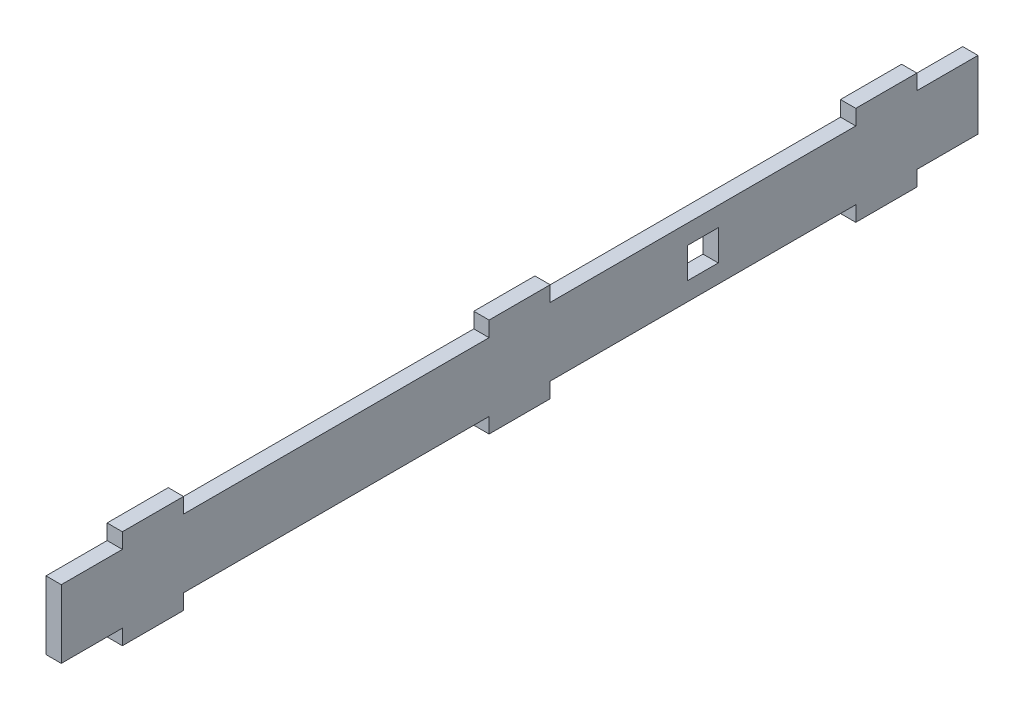
ISO-10303-21;
HEADER;
FILE_DESCRIPTION(('STEP AP214'),'2;1');
FILE_NAME('part.step','',(''),(''),'','','');
FILE_SCHEMA(('AUTOMOTIVE_DESIGN { 1 0 10303 214 1 1 1 1 }'));
ENDSEC;
DATA;
#1=APPLICATION_CONTEXT('core data for automotive mechanical design processes');
#2=APPLICATION_PROTOCOL_DEFINITION('international standard','automotive_design',2000,#1);
#3=PRODUCT_CONTEXT('',#1,'mechanical');
#4=PRODUCT('Part','Part','',(#3));
#5=PRODUCT_RELATED_PRODUCT_CATEGORY('part','',(#4));
#6=PRODUCT_DEFINITION_FORMATION('','',#4);
#7=PRODUCT_DEFINITION_CONTEXT('part definition',#1,'design');
#8=PRODUCT_DEFINITION('design','',#6,#7);
#9=PRODUCT_DEFINITION_SHAPE('','',#8);
#10=(LENGTH_UNIT() NAMED_UNIT(*) SI_UNIT(.MILLI.,.METRE.));
#11=(NAMED_UNIT(*) PLANE_ANGLE_UNIT() SI_UNIT($,.RADIAN.));
#12=(NAMED_UNIT(*) SI_UNIT($,.STERADIAN.) SOLID_ANGLE_UNIT());
#13=UNCERTAINTY_MEASURE_WITH_UNIT(LENGTH_MEASURE(1.E-05),#10,'distance_accuracy_value','');
#14=(GEOMETRIC_REPRESENTATION_CONTEXT(3) GLOBAL_UNCERTAINTY_ASSIGNED_CONTEXT((#13)) GLOBAL_UNIT_ASSIGNED_CONTEXT((#10,
#11,#12)) REPRESENTATION_CONTEXT('',''));
#15=CARTESIAN_POINT('',(0.,0.,0.));
#16=DIRECTION('',(0.,0.,1.));
#17=DIRECTION('',(1.,0.,0.));
#18=AXIS2_PLACEMENT_3D('',#15,#16,#17);
#19=CARTESIAN_POINT('',(5.,0.,0.));
#20=DIRECTION('',(0.,1.,0.));
#21=DIRECTION('',(0.,0.,1.));
#22=AXIS2_PLACEMENT_3D('',#19,#20,#21);
#23=PLANE('',#22);
#24=DIRECTION('',(-1.,0.,0.));
#25=VECTOR('',#24,1.);
#26=CARTESIAN_POINT('',(5.,0.,-260.));
#27=LINE('',#26,#25);
#28=CARTESIAN_POINT('',(5.,0.,-260.));
#29=VERTEX_POINT('',#28);
#30=CARTESIAN_POINT('',(0.,0.,-260.));
#31=VERTEX_POINT('',#30);
#32=EDGE_CURVE('E292',#29,#31,#27,.T.);
#33=ORIENTED_EDGE('',*,*,#32,.F.);
#34=DIRECTION('',(0.,0.,-1.));
#35=VECTOR('',#34,1.);
#36=CARTESIAN_POINT('',(5.,0.,0.));
#37=LINE('',#36,#35);
#38=CARTESIAN_POINT('',(5.,0.,-160.));
#39=VERTEX_POINT('',#38);
#40=EDGE_CURVE('E592',#39,#29,#37,.T.);
#41=ORIENTED_EDGE('',*,*,#40,.F.);
#42=DIRECTION('',(1.,0.,0.));
#43=VECTOR('',#42,1.);
#44=CARTESIAN_POINT('',(5.,0.,-160.));
#45=LINE('',#44,#43);
#46=CARTESIAN_POINT('',(0.,0.,-160.));
#47=VERTEX_POINT('',#46);
#48=EDGE_CURVE('E340',#47,#39,#45,.T.);
#49=ORIENTED_EDGE('',*,*,#48,.F.);
#50=DIRECTION('',(0.,0.,-1.));
#51=VECTOR('',#50,1.);
#52=CARTESIAN_POINT('',(0.,0.,0.));
#53=LINE('',#52,#51);
#54=EDGE_CURVE('E616',#47,#31,#53,.T.);
#55=ORIENTED_EDGE('',*,*,#54,.T.);
#56=EDGE_LOOP('',(#33,#41,#49,#55));
#57=FACE_BOUND('',#56,.T.);
#58=ADVANCED_FACE('F39',(#57),#23,.F.);
#59=DIRECTION('',(1.,0.,0.));
#60=VECTOR('',#59,1.);
#61=CARTESIAN_POINT('',(5.,0.,-280.));
#62=LINE('',#61,#60);
#63=CARTESIAN_POINT('',(0.,0.,-280.));
#64=VERTEX_POINT('',#63);
#65=CARTESIAN_POINT('',(5.,0.,-280.));
#66=VERTEX_POINT('',#65);
#67=EDGE_CURVE('E303',#64,#66,#62,.T.);
#68=ORIENTED_EDGE('',*,*,#67,.F.);
#69=CARTESIAN_POINT('',(0.,0.,-300.));
#70=VERTEX_POINT('',#69);
#71=EDGE_CURVE('E545',#64,#70,#53,.T.);
#72=ORIENTED_EDGE('',*,*,#71,.T.);
#73=DIRECTION('',(-1.,0.,0.));
#74=VECTOR('',#73,1.);
#75=CARTESIAN_POINT('',(5.,0.,-300.));
#76=LINE('',#75,#74);
#77=CARTESIAN_POINT('',(5.,0.,-300.));
#78=VERTEX_POINT('',#77);
#79=EDGE_CURVE('E48',#78,#70,#76,.T.);
#80=ORIENTED_EDGE('',*,*,#79,.F.);
#81=EDGE_CURVE('E524',#66,#78,#37,.T.);
#82=ORIENTED_EDGE('',*,*,#81,.F.);
#83=EDGE_LOOP('',(#68,#72,#80,#82));
#84=FACE_BOUND('',#83,.T.);
#85=ADVANCED_FACE('F626',(#84),#23,.F.);
#86=DIRECTION('',(-1.,0.,0.));
#87=VECTOR('',#86,1.);
#88=CARTESIAN_POINT('',(5.,0.,-140.));
#89=LINE('',#88,#87);
#90=CARTESIAN_POINT('',(5.,0.,-140.));
#91=VERTEX_POINT('',#90);
#92=CARTESIAN_POINT('',(0.,0.,-140.));
#93=VERTEX_POINT('',#92);
#94=EDGE_CURVE('E334',#91,#93,#89,.T.);
#95=ORIENTED_EDGE('',*,*,#94,.F.);
#96=CARTESIAN_POINT('',(5.,0.,-40.));
#97=VERTEX_POINT('',#96);
#98=EDGE_CURVE('E531',#97,#91,#37,.T.);
#99=ORIENTED_EDGE('',*,*,#98,.F.);
#100=DIRECTION('',(1.,0.,0.));
#101=VECTOR('',#100,1.);
#102=CARTESIAN_POINT('',(5.,0.,-40.));
#103=LINE('',#102,#101);
#104=CARTESIAN_POINT('',(0.,0.,-40.));
#105=VERTEX_POINT('',#104);
#106=EDGE_CURVE('E377',#105,#97,#103,.T.);
#107=ORIENTED_EDGE('',*,*,#106,.F.);
#108=EDGE_CURVE('E550',#105,#93,#53,.T.);
#109=ORIENTED_EDGE('',*,*,#108,.T.);
#110=EDGE_LOOP('',(#95,#99,#107,#109));
#111=FACE_BOUND('',#110,.T.);
#112=ADVANCED_FACE('F631',(#111),#23,.F.);
#113=DIRECTION('',(-1.,0.,0.));
#114=VECTOR('',#113,1.);
#115=CARTESIAN_POINT('',(5.,0.,-20.));
#116=LINE('',#115,#114);
#117=CARTESIAN_POINT('',(5.,0.,-20.));
#118=VERTEX_POINT('',#117);
#119=CARTESIAN_POINT('',(0.,0.,-20.));
#120=VERTEX_POINT('',#119);
#121=EDGE_CURVE('E371',#118,#120,#116,.T.);
#122=ORIENTED_EDGE('',*,*,#121,.F.);
#123=CARTESIAN_POINT('',(5.,0.,0.));
#124=VERTEX_POINT('',#123);
#125=EDGE_CURVE('E526',#124,#118,#37,.T.);
#126=ORIENTED_EDGE('',*,*,#125,.F.);
#127=DIRECTION('',(-1.,0.,0.));
#128=VECTOR('',#127,1.);
#129=CARTESIAN_POINT('',(5.,0.,0.));
#130=LINE('',#129,#128);
#131=CARTESIAN_POINT('',(0.,0.,0.));
#132=VERTEX_POINT('',#131);
#133=EDGE_CURVE('E11',#124,#132,#130,.T.);
#134=ORIENTED_EDGE('',*,*,#133,.T.);
#135=EDGE_CURVE('E546',#132,#120,#53,.T.);
#136=ORIENTED_EDGE('',*,*,#135,.T.);
#137=EDGE_LOOP('',(#122,#126,#134,#136));
#138=FACE_BOUND('',#137,.T.);
#139=ADVANCED_FACE('F644',(#138),#23,.F.);
#140=CARTESIAN_POINT('',(5.,22.32,0.));
#141=DIRECTION('',(0.,-1.,0.));
#142=DIRECTION('',(0.,0.,-1.));
#143=AXIS2_PLACEMENT_3D('',#140,#141,#142);
#144=PLANE('',#143);
#145=DIRECTION('',(1.,0.,0.));
#146=VECTOR('',#145,1.);
#147=CARTESIAN_POINT('',(0.,22.32,-140.));
#148=LINE('',#147,#146);
#149=CARTESIAN_POINT('',(0.,22.32,-140.));
#150=VERTEX_POINT('',#149);
#151=CARTESIAN_POINT('',(5.,22.32,-140.));
#152=VERTEX_POINT('',#151);
#153=EDGE_CURVE('E408',#150,#152,#148,.T.);
#154=ORIENTED_EDGE('',*,*,#153,.F.);
#155=DIRECTION('',(0.,0.,1.));
#156=VECTOR('',#155,1.);
#157=CARTESIAN_POINT('',(0.,22.32,0.));
#158=LINE('',#157,#156);
#159=CARTESIAN_POINT('',(0.,22.32,-40.));
#160=VERTEX_POINT('',#159);
#161=EDGE_CURVE('E557',#150,#160,#158,.T.);
#162=ORIENTED_EDGE('',*,*,#161,.T.);
#163=DIRECTION('',(-1.,0.,0.));
#164=VECTOR('',#163,1.);
#165=CARTESIAN_POINT('',(0.,22.32,-40.));
#166=LINE('',#165,#164);
#167=CARTESIAN_POINT('',(5.,22.32,-40.));
#168=VERTEX_POINT('',#167);
#169=EDGE_CURVE('E488',#168,#160,#166,.T.);
#170=ORIENTED_EDGE('',*,*,#169,.F.);
#171=DIRECTION('',(0.,0.,1.));
#172=VECTOR('',#171,1.);
#173=CARTESIAN_POINT('',(5.,22.32,0.));
#174=LINE('',#173,#172);
#175=EDGE_CURVE('E541',#152,#168,#174,.T.);
#176=ORIENTED_EDGE('',*,*,#175,.F.);
#177=EDGE_LOOP('',(#154,#162,#170,#176));
#178=FACE_BOUND('',#177,.T.);
#179=ADVANCED_FACE('F669',(#178),#144,.F.);
#180=DIRECTION('',(-1.,0.,0.));
#181=VECTOR('',#180,1.);
#182=CARTESIAN_POINT('',(0.,22.32,-160.));
#183=LINE('',#182,#181);
#184=CARTESIAN_POINT('',(5.,22.32,-160.));
#185=VERTEX_POINT('',#184);
#186=CARTESIAN_POINT('',(0.,22.32,-160.));
#187=VERTEX_POINT('',#186);
#188=EDGE_CURVE('E414',#185,#187,#183,.T.);
#189=ORIENTED_EDGE('',*,*,#188,.F.);
#190=CARTESIAN_POINT('',(5.,22.32,-260.));
#191=VERTEX_POINT('',#190);
#192=EDGE_CURVE('E540',#191,#185,#174,.T.);
#193=ORIENTED_EDGE('',*,*,#192,.F.);
#194=DIRECTION('',(1.,0.,0.));
#195=VECTOR('',#194,1.);
#196=CARTESIAN_POINT('',(0.,22.32,-260.));
#197=LINE('',#196,#195);
#198=CARTESIAN_POINT('',(0.,22.32,-260.));
#199=VERTEX_POINT('',#198);
#200=EDGE_CURVE('E445',#199,#191,#197,.T.);
#201=ORIENTED_EDGE('',*,*,#200,.F.);
#202=EDGE_CURVE('E556',#199,#187,#158,.T.);
#203=ORIENTED_EDGE('',*,*,#202,.T.);
#204=EDGE_LOOP('',(#189,#193,#201,#203));
#205=FACE_BOUND('',#204,.T.);
#206=ADVANCED_FACE('F674',(#205),#144,.F.);
#207=DIRECTION('',(-1.,0.,0.));
#208=VECTOR('',#207,1.);
#209=CARTESIAN_POINT('',(0.,22.32,-280.));
#210=LINE('',#209,#208);
#211=CARTESIAN_POINT('',(5.,22.32,-280.));
#212=VERTEX_POINT('',#211);
#213=CARTESIAN_POINT('',(0.,22.32,-280.));
#214=VERTEX_POINT('',#213);
#215=EDGE_CURVE('E451',#212,#214,#210,.T.);
#216=ORIENTED_EDGE('',*,*,#215,.F.);
#217=CARTESIAN_POINT('',(5.,22.32,-300.));
#218=VERTEX_POINT('',#217);
#219=EDGE_CURVE('E535',#218,#212,#174,.T.);
#220=ORIENTED_EDGE('',*,*,#219,.F.);
#221=DIRECTION('',(-1.,0.,0.));
#222=VECTOR('',#221,1.);
#223=CARTESIAN_POINT('',(5.,22.32,-300.));
#224=LINE('',#223,#222);
#225=CARTESIAN_POINT('',(0.,22.32,-300.));
#226=VERTEX_POINT('',#225);
#227=EDGE_CURVE('E561',#218,#226,#224,.T.);
#228=ORIENTED_EDGE('',*,*,#227,.T.);
#229=EDGE_CURVE('E525',#226,#214,#158,.T.);
#230=ORIENTED_EDGE('',*,*,#229,.T.);
#231=EDGE_LOOP('',(#216,#220,#228,#230));
#232=FACE_BOUND('',#231,.T.);
#233=ADVANCED_FACE('F580',(#232),#144,.F.);
#234=DIRECTION('',(1.,0.,0.));
#235=VECTOR('',#234,1.);
#236=CARTESIAN_POINT('',(0.,22.32,-20.));
#237=LINE('',#236,#235);
#238=CARTESIAN_POINT('',(0.,22.32,-20.));
#239=VERTEX_POINT('',#238);
#240=CARTESIAN_POINT('',(5.,22.32,-20.));
#241=VERTEX_POINT('',#240);
#242=EDGE_CURVE('E482',#239,#241,#237,.T.);
#243=ORIENTED_EDGE('',*,*,#242,.F.);
#244=CARTESIAN_POINT('',(0.,22.32,0.));
#245=VERTEX_POINT('',#244);
#246=EDGE_CURVE('E553',#239,#245,#158,.T.);
#247=ORIENTED_EDGE('',*,*,#246,.T.);
#248=DIRECTION('',(-1.,0.,0.));
#249=VECTOR('',#248,1.);
#250=CARTESIAN_POINT('',(5.,22.32,0.));
#251=LINE('',#250,#249);
#252=CARTESIAN_POINT('',(5.,22.32,0.));
#253=VERTEX_POINT('',#252);
#254=EDGE_CURVE('E539',#253,#245,#251,.T.);
#255=ORIENTED_EDGE('',*,*,#254,.F.);
#256=EDGE_CURVE('E534',#241,#253,#174,.T.);
#257=ORIENTED_EDGE('',*,*,#256,.F.);
#258=EDGE_LOOP('',(#243,#247,#255,#257));
#259=FACE_BOUND('',#258,.T.);
#260=ADVANCED_FACE('F718',(#259),#144,.F.);
#261=CARTESIAN_POINT('',(5.,0.,0.));
#262=DIRECTION('',(0.,0.,-1.));
#263=DIRECTION('',(-1.,0.,0.));
#264=AXIS2_PLACEMENT_3D('',#261,#262,#263);
#265=PLANE('',#264);
#266=DIRECTION('',(0.,-1.,0.));
#267=VECTOR('',#266,1.);
#268=CARTESIAN_POINT('',(0.,0.,0.));
#269=LINE('',#268,#267);
#270=EDGE_CURVE('E519',#245,#132,#269,.T.);
#271=ORIENTED_EDGE('',*,*,#270,.T.);
#272=ORIENTED_EDGE('',*,*,#133,.F.);
#273=DIRECTION('',(0.,-1.,0.));
#274=VECTOR('',#273,1.);
#275=CARTESIAN_POINT('',(5.,0.,0.));
#276=LINE('',#275,#274);
#277=EDGE_CURVE('E520',#253,#124,#276,.T.);
#278=ORIENTED_EDGE('',*,*,#277,.F.);
#279=ORIENTED_EDGE('',*,*,#254,.T.);
#280=EDGE_LOOP('',(#271,#272,#278,#279));
#281=FACE_BOUND('',#280,.T.);
#282=ADVANCED_FACE('F41',(#281),#265,.F.);
#283=CARTESIAN_POINT('',(5.,0.,-300.));
#284=DIRECTION('',(0.,0.,1.));
#285=DIRECTION('',(1.,0.,0.));
#286=AXIS2_PLACEMENT_3D('',#283,#284,#285);
#287=PLANE('',#286);
#288=DIRECTION('',(0.,1.,0.));
#289=VECTOR('',#288,1.);
#290=CARTESIAN_POINT('',(0.,0.,-300.));
#291=LINE('',#290,#289);
#292=EDGE_CURVE('E549',#70,#226,#291,.T.);
#293=ORIENTED_EDGE('',*,*,#292,.T.);
#294=ORIENTED_EDGE('',*,*,#227,.F.);
#295=DIRECTION('',(0.,1.,0.));
#296=VECTOR('',#295,1.);
#297=CARTESIAN_POINT('',(5.,0.,-300.));
#298=LINE('',#297,#296);
#299=EDGE_CURVE('E530',#78,#218,#298,.T.);
#300=ORIENTED_EDGE('',*,*,#299,.F.);
#301=ORIENTED_EDGE('',*,*,#79,.T.);
#302=EDGE_LOOP('',(#293,#294,#300,#301));
#303=FACE_BOUND('',#302,.T.);
#304=ADVANCED_FACE('F570',(#303),#287,.F.);
#305=CARTESIAN_POINT('',(5.,0.,0.));
#306=DIRECTION('',(-1.,0.,0.));
#307=DIRECTION('',(0.,0.,1.));
#308=AXIS2_PLACEMENT_3D('',#305,#306,#307);
#309=PLANE('',#308);
#310=DIRECTION('',(0.,0.,1.));
#311=VECTOR('',#310,1.);
#312=CARTESIAN_POINT('',(5.,16.,-215.));
#313=LINE('',#312,#311);
#314=CARTESIAN_POINT('',(5.,16.,-215.));
#315=VERTEX_POINT('',#314);
#316=CARTESIAN_POINT('',(5.,16.,-205.));
#317=VERTEX_POINT('',#316);
#318=EDGE_CURVE('E283',#315,#317,#313,.T.);
#319=ORIENTED_EDGE('',*,*,#318,.F.);
#320=DIRECTION('',(0.,1.,0.));
#321=VECTOR('',#320,1.);
#322=CARTESIAN_POINT('',(5.,16.,-215.));
#323=LINE('',#322,#321);
#324=CARTESIAN_POINT('',(5.,6.,-215.));
#325=VERTEX_POINT('',#324);
#326=EDGE_CURVE('E55',#325,#315,#323,.T.);
#327=ORIENTED_EDGE('',*,*,#326,.F.);
#328=DIRECTION('',(0.,0.,-1.));
#329=VECTOR('',#328,1.);
#330=CARTESIAN_POINT('',(5.,6.,-215.));
#331=LINE('',#330,#329);
#332=CARTESIAN_POINT('',(5.,6.,-205.));
#333=VERTEX_POINT('',#332);
#334=EDGE_CURVE('E270',#333,#325,#331,.T.);
#335=ORIENTED_EDGE('',*,*,#334,.F.);
#336=DIRECTION('',(0.,-1.,0.));
#337=VECTOR('',#336,1.);
#338=CARTESIAN_POINT('',(5.,16.,-205.));
#339=LINE('',#338,#337);
#340=EDGE_CURVE('E274',#317,#333,#339,.T.);
#341=ORIENTED_EDGE('',*,*,#340,.F.);
#342=EDGE_LOOP('',(#319,#327,#335,#341));
#343=FACE_BOUND('',#342,.T.);
#344=ORIENTED_EDGE('',*,*,#277,.T.);
#345=ORIENTED_EDGE('',*,*,#125,.T.);
#346=DIRECTION('',(0.,1.,0.));
#347=VECTOR('',#346,1.);
#348=CARTESIAN_POINT('',(5.,-5.,-20.));
#349=LINE('',#348,#347);
#350=CARTESIAN_POINT('',(5.,-5.,-20.));
#351=VERTEX_POINT('',#350);
#352=EDGE_CURVE('E404',#351,#118,#349,.T.);
#353=ORIENTED_EDGE('',*,*,#352,.F.);
#354=DIRECTION('',(0.,0.,1.));
#355=VECTOR('',#354,1.);
#356=CARTESIAN_POINT('',(5.,-5.,-20.));
#357=LINE('',#356,#355);
#358=CARTESIAN_POINT('',(5.,-5.,-40.));
#359=VERTEX_POINT('',#358);
#360=EDGE_CURVE('E372',#359,#351,#357,.T.);
#361=ORIENTED_EDGE('',*,*,#360,.F.);
#362=DIRECTION('',(0.,1.,0.));
#363=VECTOR('',#362,1.);
#364=CARTESIAN_POINT('',(5.,-5.,-40.));
#365=LINE('',#364,#363);
#366=EDGE_CURVE('E386',#359,#97,#365,.T.);
#367=ORIENTED_EDGE('',*,*,#366,.T.);
#368=ORIENTED_EDGE('',*,*,#98,.T.);
#369=DIRECTION('',(0.,1.,0.));
#370=VECTOR('',#369,1.);
#371=CARTESIAN_POINT('',(5.,-5.,-140.));
#372=LINE('',#371,#370);
#373=CARTESIAN_POINT('',(5.,-5.,-140.));
#374=VERTEX_POINT('',#373);
#375=EDGE_CURVE('E367',#374,#91,#372,.T.);
#376=ORIENTED_EDGE('',*,*,#375,.F.);
#377=DIRECTION('',(0.,0.,1.));
#378=VECTOR('',#377,1.);
#379=CARTESIAN_POINT('',(5.,-5.,-140.));
#380=LINE('',#379,#378);
#381=CARTESIAN_POINT('',(5.,-5.,-160.));
#382=VERTEX_POINT('',#381);
#383=EDGE_CURVE('E335',#382,#374,#380,.T.);
#384=ORIENTED_EDGE('',*,*,#383,.F.);
#385=DIRECTION('',(0.,1.,0.));
#386=VECTOR('',#385,1.);
#387=CARTESIAN_POINT('',(5.,-5.,-160.));
#388=LINE('',#387,#386);
#389=EDGE_CURVE('E349',#382,#39,#388,.T.);
#390=ORIENTED_EDGE('',*,*,#389,.T.);
#391=ORIENTED_EDGE('',*,*,#40,.T.);
#392=DIRECTION('',(0.,1.,0.));
#393=VECTOR('',#392,1.);
#394=CARTESIAN_POINT('',(5.,-5.,-260.));
#395=LINE('',#394,#393);
#396=CARTESIAN_POINT('',(5.,-5.,-260.));
#397=VERTEX_POINT('',#396);
#398=EDGE_CURVE('E330',#397,#29,#395,.T.);
#399=ORIENTED_EDGE('',*,*,#398,.F.);
#400=DIRECTION('',(0.,0.,1.));
#401=VECTOR('',#400,1.);
#402=CARTESIAN_POINT('',(5.,-5.,-260.));
#403=LINE('',#402,#401);
#404=CARTESIAN_POINT('',(5.,-5.,-280.));
#405=VERTEX_POINT('',#404);
#406=EDGE_CURVE('E298',#405,#397,#403,.T.);
#407=ORIENTED_EDGE('',*,*,#406,.F.);
#408=DIRECTION('',(0.,1.,0.));
#409=VECTOR('',#408,1.);
#410=CARTESIAN_POINT('',(5.,-5.,-280.));
#411=LINE('',#410,#409);
#412=EDGE_CURVE('E312',#405,#66,#411,.T.);
#413=ORIENTED_EDGE('',*,*,#412,.T.);
#414=ORIENTED_EDGE('',*,*,#81,.T.);
#415=ORIENTED_EDGE('',*,*,#299,.T.);
#416=ORIENTED_EDGE('',*,*,#219,.T.);
#417=DIRECTION('',(0.,-1.,0.));
#418=VECTOR('',#417,1.);
#419=CARTESIAN_POINT('',(5.,27.32,-280.));
#420=LINE('',#419,#418);
#421=CARTESIAN_POINT('',(5.,27.32,-280.));
#422=VERTEX_POINT('',#421);
#423=EDGE_CURVE('E470',#422,#212,#420,.T.);
#424=ORIENTED_EDGE('',*,*,#423,.F.);
#425=DIRECTION('',(0.,0.,-1.));
#426=VECTOR('',#425,1.);
#427=CARTESIAN_POINT('',(5.,27.32,-280.));
#428=LINE('',#427,#426);
#429=CARTESIAN_POINT('',(5.,27.32,-260.));
#430=VERTEX_POINT('',#429);
#431=EDGE_CURVE('E454',#430,#422,#428,.T.);
#432=ORIENTED_EDGE('',*,*,#431,.F.);
#433=DIRECTION('',(0.,-1.,0.));
#434=VECTOR('',#433,1.);
#435=CARTESIAN_POINT('',(5.,27.32,-260.));
#436=LINE('',#435,#434);
#437=EDGE_CURVE('E474',#430,#191,#436,.T.);
#438=ORIENTED_EDGE('',*,*,#437,.T.);
#439=ORIENTED_EDGE('',*,*,#192,.T.);
#440=DIRECTION('',(0.,-1.,0.));
#441=VECTOR('',#440,1.);
#442=CARTESIAN_POINT('',(5.,27.32,-160.));
#443=LINE('',#442,#441);
#444=CARTESIAN_POINT('',(5.,27.32,-160.));
#445=VERTEX_POINT('',#444);
#446=EDGE_CURVE('E433',#445,#185,#443,.T.);
#447=ORIENTED_EDGE('',*,*,#446,.F.);
#448=DIRECTION('',(0.,0.,-1.));
#449=VECTOR('',#448,1.);
#450=CARTESIAN_POINT('',(5.,27.32,-160.));
#451=LINE('',#450,#449);
#452=CARTESIAN_POINT('',(5.,27.32,-140.));
#453=VERTEX_POINT('',#452);
#454=EDGE_CURVE('E417',#453,#445,#451,.T.);
#455=ORIENTED_EDGE('',*,*,#454,.F.);
#456=DIRECTION('',(0.,-1.,0.));
#457=VECTOR('',#456,1.);
#458=CARTESIAN_POINT('',(5.,27.32,-140.));
#459=LINE('',#458,#457);
#460=EDGE_CURVE('E437',#453,#152,#459,.T.);
#461=ORIENTED_EDGE('',*,*,#460,.T.);
#462=ORIENTED_EDGE('',*,*,#175,.T.);
#463=DIRECTION('',(0.,-1.,0.));
#464=VECTOR('',#463,1.);
#465=CARTESIAN_POINT('',(5.,27.32,-40.));
#466=LINE('',#465,#464);
#467=CARTESIAN_POINT('',(5.,27.32,-40.));
#468=VERTEX_POINT('',#467);
#469=EDGE_CURVE('E507',#468,#168,#466,.T.);
#470=ORIENTED_EDGE('',*,*,#469,.F.);
#471=DIRECTION('',(0.,0.,-1.));
#472=VECTOR('',#471,1.);
#473=CARTESIAN_POINT('',(5.,27.32,-20.));
#474=LINE('',#473,#472);
#475=CARTESIAN_POINT('',(5.,27.32,-20.));
#476=VERTEX_POINT('',#475);
#477=EDGE_CURVE('E491',#476,#468,#474,.T.);
#478=ORIENTED_EDGE('',*,*,#477,.F.);
#479=DIRECTION('',(0.,-1.,0.));
#480=VECTOR('',#479,1.);
#481=CARTESIAN_POINT('',(5.,27.32,-20.));
#482=LINE('',#481,#480);
#483=EDGE_CURVE('E511',#476,#241,#482,.T.);
#484=ORIENTED_EDGE('',*,*,#483,.T.);
#485=ORIENTED_EDGE('',*,*,#256,.T.);
#486=EDGE_LOOP('',(#344,#345,#353,#361,#367,#368,#376,#384,#390,#391,#399,#407,#413,#414,#415,
#416,#424,#432,#438,#439,#447,#455,#461,#462,#470,#478,#484,#485));
#487=FACE_BOUND('',#486,.T.);
#488=ADVANCED_FACE('F588',(#343,#487),#309,.F.);
#489=CARTESIAN_POINT('',(0.,0.,0.));
#490=DIRECTION('',(-1.,0.,0.));
#491=DIRECTION('',(0.,0.,1.));
#492=AXIS2_PLACEMENT_3D('',#489,#490,#491);
#493=PLANE('',#492);
#494=DIRECTION('',(0.,1.,0.));
#495=VECTOR('',#494,1.);
#496=CARTESIAN_POINT('',(0.,16.,-215.));
#497=LINE('',#496,#495);
#498=CARTESIAN_POINT('',(0.,6.,-215.));
#499=VERTEX_POINT('',#498);
#500=CARTESIAN_POINT('',(0.,16.,-215.));
#501=VERTEX_POINT('',#500);
#502=EDGE_CURVE('E251',#499,#501,#497,.T.);
#503=ORIENTED_EDGE('',*,*,#502,.T.);
#504=DIRECTION('',(0.,0.,1.));
#505=VECTOR('',#504,1.);
#506=CARTESIAN_POINT('',(0.,16.,-215.));
#507=LINE('',#506,#505);
#508=CARTESIAN_POINT('',(0.,16.,-205.));
#509=VERTEX_POINT('',#508);
#510=EDGE_CURVE('E261',#501,#509,#507,.T.);
#511=ORIENTED_EDGE('',*,*,#510,.T.);
#512=DIRECTION('',(0.,-1.,0.));
#513=VECTOR('',#512,1.);
#514=CARTESIAN_POINT('',(0.,16.,-205.));
#515=LINE('',#514,#513);
#516=CARTESIAN_POINT('',(0.,6.,-205.));
#517=VERTEX_POINT('',#516);
#518=EDGE_CURVE('E63',#509,#517,#515,.T.);
#519=ORIENTED_EDGE('',*,*,#518,.T.);
#520=DIRECTION('',(0.,0.,-1.));
#521=VECTOR('',#520,1.);
#522=CARTESIAN_POINT('',(0.,6.,-215.));
#523=LINE('',#522,#521);
#524=EDGE_CURVE('E258',#517,#499,#523,.T.);
#525=ORIENTED_EDGE('',*,*,#524,.T.);
#526=EDGE_LOOP('',(#503,#511,#519,#525));
#527=FACE_BOUND('',#526,.T.);
#528=ORIENTED_EDGE('',*,*,#270,.F.);
#529=ORIENTED_EDGE('',*,*,#246,.F.);
#530=DIRECTION('',(0.,-1.,0.));
#531=VECTOR('',#530,1.);
#532=CARTESIAN_POINT('',(0.,27.32,-20.));
#533=LINE('',#532,#531);
#534=CARTESIAN_POINT('',(0.,27.32,-20.));
#535=VERTEX_POINT('',#534);
#536=EDGE_CURVE('E515',#535,#239,#533,.T.);
#537=ORIENTED_EDGE('',*,*,#536,.F.);
#538=DIRECTION('',(0.,0.,1.));
#539=VECTOR('',#538,1.);
#540=CARTESIAN_POINT('',(0.,27.32,-20.));
#541=LINE('',#540,#539);
#542=CARTESIAN_POINT('',(0.,27.32,-40.));
#543=VERTEX_POINT('',#542);
#544=EDGE_CURVE('E483',#543,#535,#541,.T.);
#545=ORIENTED_EDGE('',*,*,#544,.F.);
#546=DIRECTION('',(0.,-1.,0.));
#547=VECTOR('',#546,1.);
#548=CARTESIAN_POINT('',(0.,27.32,-40.));
#549=LINE('',#548,#547);
#550=EDGE_CURVE('E497',#543,#160,#549,.T.);
#551=ORIENTED_EDGE('',*,*,#550,.T.);
#552=ORIENTED_EDGE('',*,*,#161,.F.);
#553=DIRECTION('',(0.,-1.,0.));
#554=VECTOR('',#553,1.);
#555=CARTESIAN_POINT('',(0.,27.32,-140.));
#556=LINE('',#555,#554);
#557=CARTESIAN_POINT('',(0.,27.32,-140.));
#558=VERTEX_POINT('',#557);
#559=EDGE_CURVE('E441',#558,#150,#556,.T.);
#560=ORIENTED_EDGE('',*,*,#559,.F.);
#561=DIRECTION('',(0.,0.,1.));
#562=VECTOR('',#561,1.);
#563=CARTESIAN_POINT('',(0.,27.32,-160.));
#564=LINE('',#563,#562);
#565=CARTESIAN_POINT('',(0.,27.32,-160.));
#566=VERTEX_POINT('',#565);
#567=EDGE_CURVE('E409',#566,#558,#564,.T.);
#568=ORIENTED_EDGE('',*,*,#567,.F.);
#569=DIRECTION('',(0.,-1.,0.));
#570=VECTOR('',#569,1.);
#571=CARTESIAN_POINT('',(0.,27.32,-160.));
#572=LINE('',#571,#570);
#573=EDGE_CURVE('E423',#566,#187,#572,.T.);
#574=ORIENTED_EDGE('',*,*,#573,.T.);
#575=ORIENTED_EDGE('',*,*,#202,.F.);
#576=DIRECTION('',(0.,-1.,0.));
#577=VECTOR('',#576,1.);
#578=CARTESIAN_POINT('',(0.,27.32,-260.));
#579=LINE('',#578,#577);
#580=CARTESIAN_POINT('',(0.,27.32,-260.));
#581=VERTEX_POINT('',#580);
#582=EDGE_CURVE('E478',#581,#199,#579,.T.);
#583=ORIENTED_EDGE('',*,*,#582,.F.);
#584=DIRECTION('',(0.,0.,1.));
#585=VECTOR('',#584,1.);
#586=CARTESIAN_POINT('',(0.,27.32,-280.));
#587=LINE('',#586,#585);
#588=CARTESIAN_POINT('',(0.,27.32,-280.));
#589=VERTEX_POINT('',#588);
#590=EDGE_CURVE('E446',#589,#581,#587,.T.);
#591=ORIENTED_EDGE('',*,*,#590,.F.);
#592=DIRECTION('',(0.,-1.,0.));
#593=VECTOR('',#592,1.);
#594=CARTESIAN_POINT('',(0.,27.32,-280.));
#595=LINE('',#594,#593);
#596=EDGE_CURVE('E460',#589,#214,#595,.T.);
#597=ORIENTED_EDGE('',*,*,#596,.T.);
#598=ORIENTED_EDGE('',*,*,#229,.F.);
#599=ORIENTED_EDGE('',*,*,#292,.F.);
#600=ORIENTED_EDGE('',*,*,#71,.F.);
#601=DIRECTION('',(0.,1.,0.));
#602=VECTOR('',#601,1.);
#603=CARTESIAN_POINT('',(0.,-5.,-280.));
#604=LINE('',#603,#602);
#605=CARTESIAN_POINT('',(0.,-5.,-280.));
#606=VERTEX_POINT('',#605);
#607=EDGE_CURVE('E322',#606,#64,#604,.T.);
#608=ORIENTED_EDGE('',*,*,#607,.F.);
#609=DIRECTION('',(0.,0.,-1.));
#610=VECTOR('',#609,1.);
#611=CARTESIAN_POINT('',(0.,-5.,-260.));
#612=LINE('',#611,#610);
#613=CARTESIAN_POINT('',(0.,-5.,-260.));
#614=VERTEX_POINT('',#613);
#615=EDGE_CURVE('E306',#614,#606,#612,.T.);
#616=ORIENTED_EDGE('',*,*,#615,.F.);
#617=DIRECTION('',(0.,1.,0.));
#618=VECTOR('',#617,1.);
#619=CARTESIAN_POINT('',(0.,-5.,-260.));
#620=LINE('',#619,#618);
#621=EDGE_CURVE('E326',#614,#31,#620,.T.);
#622=ORIENTED_EDGE('',*,*,#621,.T.);
#623=ORIENTED_EDGE('',*,*,#54,.F.);
#624=DIRECTION('',(0.,1.,0.));
#625=VECTOR('',#624,1.);
#626=CARTESIAN_POINT('',(0.,-5.,-160.));
#627=LINE('',#626,#625);
#628=CARTESIAN_POINT('',(0.,-5.,-160.));
#629=VERTEX_POINT('',#628);
#630=EDGE_CURVE('E359',#629,#47,#627,.T.);
#631=ORIENTED_EDGE('',*,*,#630,.F.);
#632=DIRECTION('',(0.,0.,-1.));
#633=VECTOR('',#632,1.);
#634=CARTESIAN_POINT('',(0.,-5.,-140.));
#635=LINE('',#634,#633);
#636=CARTESIAN_POINT('',(0.,-5.,-140.));
#637=VERTEX_POINT('',#636);
#638=EDGE_CURVE('E343',#637,#629,#635,.T.);
#639=ORIENTED_EDGE('',*,*,#638,.F.);
#640=DIRECTION('',(0.,1.,0.));
#641=VECTOR('',#640,1.);
#642=CARTESIAN_POINT('',(0.,-5.,-140.));
#643=LINE('',#642,#641);
#644=EDGE_CURVE('E363',#637,#93,#643,.T.);
#645=ORIENTED_EDGE('',*,*,#644,.T.);
#646=ORIENTED_EDGE('',*,*,#108,.F.);
#647=DIRECTION('',(0.,1.,0.));
#648=VECTOR('',#647,1.);
#649=CARTESIAN_POINT('',(0.,-5.,-40.));
#650=LINE('',#649,#648);
#651=CARTESIAN_POINT('',(0.,-5.,-40.));
#652=VERTEX_POINT('',#651);
#653=EDGE_CURVE('E396',#652,#105,#650,.T.);
#654=ORIENTED_EDGE('',*,*,#653,.F.);
#655=DIRECTION('',(0.,0.,-1.));
#656=VECTOR('',#655,1.);
#657=CARTESIAN_POINT('',(0.,-5.,-20.));
#658=LINE('',#657,#656);
#659=CARTESIAN_POINT('',(0.,-5.,-20.));
#660=VERTEX_POINT('',#659);
#661=EDGE_CURVE('E380',#660,#652,#658,.T.);
#662=ORIENTED_EDGE('',*,*,#661,.F.);
#663=DIRECTION('',(0.,1.,0.));
#664=VECTOR('',#663,1.);
#665=CARTESIAN_POINT('',(0.,-5.,-20.));
#666=LINE('',#665,#664);
#667=EDGE_CURVE('E400',#660,#120,#666,.T.);
#668=ORIENTED_EDGE('',*,*,#667,.T.);
#669=ORIENTED_EDGE('',*,*,#135,.F.);
#670=EDGE_LOOP('',(#528,#529,#537,#545,#551,#552,#560,#568,#574,#575,#583,#591,#597,#598,#599,
#600,#608,#616,#622,#623,#631,#639,#645,#646,#654,#662,#668,#669));
#671=FACE_BOUND('',#670,.T.);
#672=ADVANCED_FACE('F266',(#527,#671),#493,.T.);
#673=CARTESIAN_POINT('',(0.,27.32,-20.));
#674=DIRECTION('',(0.,0.,-1.));
#675=DIRECTION('',(-1.,0.,0.));
#676=AXIS2_PLACEMENT_3D('',#673,#674,#675);
#677=PLANE('',#676);
#678=ORIENTED_EDGE('',*,*,#242,.T.);
#679=ORIENTED_EDGE('',*,*,#483,.F.);
#680=DIRECTION('',(1.,0.,0.));
#681=VECTOR('',#680,1.);
#682=CARTESIAN_POINT('',(0.,27.32,-20.));
#683=LINE('',#682,#681);
#684=EDGE_CURVE('E487',#535,#476,#683,.T.);
#685=ORIENTED_EDGE('',*,*,#684,.F.);
#686=ORIENTED_EDGE('',*,*,#536,.T.);
#687=EDGE_LOOP('',(#678,#679,#685,#686));
#688=FACE_BOUND('',#687,.T.);
#689=ADVANCED_FACE('F655',(#688),#677,.F.);
#690=CARTESIAN_POINT('',(0.,27.32,-40.));
#691=DIRECTION('',(0.,0.,1.));
#692=DIRECTION('',(1.,0.,0.));
#693=AXIS2_PLACEMENT_3D('',#690,#691,#692);
#694=PLANE('',#693);
#695=ORIENTED_EDGE('',*,*,#169,.T.);
#696=ORIENTED_EDGE('',*,*,#550,.F.);
#697=DIRECTION('',(-1.,0.,0.));
#698=VECTOR('',#697,1.);
#699=CARTESIAN_POINT('',(0.,27.32,-40.));
#700=LINE('',#699,#698);
#701=EDGE_CURVE('E494',#468,#543,#700,.T.);
#702=ORIENTED_EDGE('',*,*,#701,.F.);
#703=ORIENTED_EDGE('',*,*,#469,.T.);
#704=EDGE_LOOP('',(#695,#696,#702,#703));
#705=FACE_BOUND('',#704,.T.);
#706=ADVANCED_FACE('F665',(#705),#694,.F.);
#707=CARTESIAN_POINT('',(0.,27.32,0.));
#708=DIRECTION('',(0.,-1.,0.));
#709=DIRECTION('',(0.,0.,-1.));
#710=AXIS2_PLACEMENT_3D('',#707,#708,#709);
#711=PLANE('',#710);
#712=ORIENTED_EDGE('',*,*,#544,.T.);
#713=ORIENTED_EDGE('',*,*,#684,.T.);
#714=ORIENTED_EDGE('',*,*,#477,.T.);
#715=ORIENTED_EDGE('',*,*,#701,.T.);
#716=EDGE_LOOP('',(#712,#713,#714,#715));
#717=FACE_BOUND('',#716,.T.);
#718=ADVANCED_FACE('F659',(#717),#711,.F.);
#719=CARTESIAN_POINT('',(0.,27.32,-260.));
#720=DIRECTION('',(0.,0.,-1.));
#721=DIRECTION('',(-1.,0.,0.));
#722=AXIS2_PLACEMENT_3D('',#719,#720,#721);
#723=PLANE('',#722);
#724=ORIENTED_EDGE('',*,*,#200,.T.);
#725=ORIENTED_EDGE('',*,*,#437,.F.);
#726=DIRECTION('',(1.,0.,0.));
#727=VECTOR('',#726,1.);
#728=CARTESIAN_POINT('',(0.,27.32,-260.));
#729=LINE('',#728,#727);
#730=EDGE_CURVE('E450',#581,#430,#729,.T.);
#731=ORIENTED_EDGE('',*,*,#730,.F.);
#732=ORIENTED_EDGE('',*,*,#582,.T.);
#733=EDGE_LOOP('',(#724,#725,#731,#732));
#734=FACE_BOUND('',#733,.T.);
#735=ADVANCED_FACE('F805',(#734),#723,.F.);
#736=CARTESIAN_POINT('',(0.,27.32,-280.));
#737=DIRECTION('',(0.,0.,1.));
#738=DIRECTION('',(1.,0.,0.));
#739=AXIS2_PLACEMENT_3D('',#736,#737,#738);
#740=PLANE('',#739);
#741=ORIENTED_EDGE('',*,*,#215,.T.);
#742=ORIENTED_EDGE('',*,*,#596,.F.);
#743=DIRECTION('',(-1.,0.,0.));
#744=VECTOR('',#743,1.);
#745=CARTESIAN_POINT('',(0.,27.32,-280.));
#746=LINE('',#745,#744);
#747=EDGE_CURVE('E457',#422,#589,#746,.T.);
#748=ORIENTED_EDGE('',*,*,#747,.F.);
#749=ORIENTED_EDGE('',*,*,#423,.T.);
#750=EDGE_LOOP('',(#741,#742,#748,#749));
#751=FACE_BOUND('',#750,.T.);
#752=ADVANCED_FACE('F583',(#751),#740,.F.);
#753=CARTESIAN_POINT('',(0.,27.32,0.));
#754=DIRECTION('',(0.,1.,0.));
#755=DIRECTION('',(0.,0.,1.));
#756=AXIS2_PLACEMENT_3D('',#753,#754,#755);
#757=PLANE('',#756);
#758=ORIENTED_EDGE('',*,*,#590,.T.);
#759=ORIENTED_EDGE('',*,*,#730,.T.);
#760=ORIENTED_EDGE('',*,*,#431,.T.);
#761=ORIENTED_EDGE('',*,*,#747,.T.);
#762=EDGE_LOOP('',(#758,#759,#760,#761));
#763=FACE_BOUND('',#762,.T.);
#764=ADVANCED_FACE('F694',(#763),#757,.T.);
#765=CARTESIAN_POINT('',(0.,27.32,-140.));
#766=DIRECTION('',(0.,0.,-1.));
#767=DIRECTION('',(-1.,0.,0.));
#768=AXIS2_PLACEMENT_3D('',#765,#766,#767);
#769=PLANE('',#768);
#770=ORIENTED_EDGE('',*,*,#153,.T.);
#771=ORIENTED_EDGE('',*,*,#460,.F.);
#772=DIRECTION('',(1.,0.,0.));
#773=VECTOR('',#772,1.);
#774=CARTESIAN_POINT('',(0.,27.32,-140.));
#775=LINE('',#774,#773);
#776=EDGE_CURVE('E413',#558,#453,#775,.T.);
#777=ORIENTED_EDGE('',*,*,#776,.F.);
#778=ORIENTED_EDGE('',*,*,#559,.T.);
#779=EDGE_LOOP('',(#770,#771,#777,#778));
#780=FACE_BOUND('',#779,.T.);
#781=ADVANCED_FACE('F692',(#780),#769,.F.);
#782=CARTESIAN_POINT('',(0.,27.32,-160.));
#783=DIRECTION('',(0.,0.,1.));
#784=DIRECTION('',(1.,0.,0.));
#785=AXIS2_PLACEMENT_3D('',#782,#783,#784);
#786=PLANE('',#785);
#787=ORIENTED_EDGE('',*,*,#188,.T.);
#788=ORIENTED_EDGE('',*,*,#573,.F.);
#789=DIRECTION('',(-1.,0.,0.));
#790=VECTOR('',#789,1.);
#791=CARTESIAN_POINT('',(0.,27.32,-160.));
#792=LINE('',#791,#790);
#793=EDGE_CURVE('E420',#445,#566,#792,.T.);
#794=ORIENTED_EDGE('',*,*,#793,.F.);
#795=ORIENTED_EDGE('',*,*,#446,.T.);
#796=EDGE_LOOP('',(#787,#788,#794,#795));
#797=FACE_BOUND('',#796,.T.);
#798=ADVANCED_FACE('F679',(#797),#786,.F.);
#799=CARTESIAN_POINT('',(0.,27.32,0.));
#800=DIRECTION('',(0.,1.,0.));
#801=DIRECTION('',(0.,0.,1.));
#802=AXIS2_PLACEMENT_3D('',#799,#800,#801);
#803=PLANE('',#802);
#804=ORIENTED_EDGE('',*,*,#567,.T.);
#805=ORIENTED_EDGE('',*,*,#776,.T.);
#806=ORIENTED_EDGE('',*,*,#454,.T.);
#807=ORIENTED_EDGE('',*,*,#793,.T.);
#808=EDGE_LOOP('',(#804,#805,#806,#807));
#809=FACE_BOUND('',#808,.T.);
#810=ADVANCED_FACE('F684',(#809),#803,.T.);
#811=CARTESIAN_POINT('',(5.,-5.,-20.));
#812=DIRECTION('',(0.,0.,-1.));
#813=DIRECTION('',(-1.,0.,0.));
#814=AXIS2_PLACEMENT_3D('',#811,#812,#813);
#815=PLANE('',#814);
#816=ORIENTED_EDGE('',*,*,#121,.T.);
#817=ORIENTED_EDGE('',*,*,#667,.F.);
#818=DIRECTION('',(-1.,0.,0.));
#819=VECTOR('',#818,1.);
#820=CARTESIAN_POINT('',(5.,-5.,-20.));
#821=LINE('',#820,#819);
#822=EDGE_CURVE('E376',#351,#660,#821,.T.);
#823=ORIENTED_EDGE('',*,*,#822,.F.);
#824=ORIENTED_EDGE('',*,*,#352,.T.);
#825=EDGE_LOOP('',(#816,#817,#823,#824));
#826=FACE_BOUND('',#825,.T.);
#827=ADVANCED_FACE('F642',(#826),#815,.F.);
#828=CARTESIAN_POINT('',(5.,-5.,-40.));
#829=DIRECTION('',(0.,0.,1.));
#830=DIRECTION('',(1.,0.,0.));
#831=AXIS2_PLACEMENT_3D('',#828,#829,#830);
#832=PLANE('',#831);
#833=ORIENTED_EDGE('',*,*,#106,.T.);
#834=ORIENTED_EDGE('',*,*,#366,.F.);
#835=DIRECTION('',(1.,0.,0.));
#836=VECTOR('',#835,1.);
#837=CARTESIAN_POINT('',(5.,-5.,-40.));
#838=LINE('',#837,#836);
#839=EDGE_CURVE('E383',#652,#359,#838,.T.);
#840=ORIENTED_EDGE('',*,*,#839,.F.);
#841=ORIENTED_EDGE('',*,*,#653,.T.);
#842=EDGE_LOOP('',(#833,#834,#840,#841));
#843=FACE_BOUND('',#842,.T.);
#844=ADVANCED_FACE('F636',(#843),#832,.F.);
#845=CARTESIAN_POINT('',(0.,-5.,0.));
#846=DIRECTION('',(0.,1.,0.));
#847=DIRECTION('',(0.,0.,1.));
#848=AXIS2_PLACEMENT_3D('',#845,#846,#847);
#849=PLANE('',#848);
#850=ORIENTED_EDGE('',*,*,#360,.T.);
#851=ORIENTED_EDGE('',*,*,#822,.T.);
#852=ORIENTED_EDGE('',*,*,#661,.T.);
#853=ORIENTED_EDGE('',*,*,#839,.T.);
#854=EDGE_LOOP('',(#850,#851,#852,#853));
#855=FACE_BOUND('',#854,.T.);
#856=ADVANCED_FACE('F638',(#855),#849,.F.);
#857=CARTESIAN_POINT('',(5.,-5.,-140.));
#858=DIRECTION('',(0.,0.,-1.));
#859=DIRECTION('',(-1.,0.,0.));
#860=AXIS2_PLACEMENT_3D('',#857,#858,#859);
#861=PLANE('',#860);
#862=ORIENTED_EDGE('',*,*,#94,.T.);
#863=ORIENTED_EDGE('',*,*,#644,.F.);
#864=DIRECTION('',(-1.,0.,0.));
#865=VECTOR('',#864,1.);
#866=CARTESIAN_POINT('',(5.,-5.,-140.));
#867=LINE('',#866,#865);
#868=EDGE_CURVE('E339',#374,#637,#867,.T.);
#869=ORIENTED_EDGE('',*,*,#868,.F.);
#870=ORIENTED_EDGE('',*,*,#375,.T.);
#871=EDGE_LOOP('',(#862,#863,#869,#870));
#872=FACE_BOUND('',#871,.T.);
#873=ADVANCED_FACE('F604',(#872),#861,.F.);
#874=CARTESIAN_POINT('',(5.,-5.,-160.));
#875=DIRECTION('',(0.,0.,1.));
#876=DIRECTION('',(1.,0.,0.));
#877=AXIS2_PLACEMENT_3D('',#874,#875,#876);
#878=PLANE('',#877);
#879=ORIENTED_EDGE('',*,*,#48,.T.);
#880=ORIENTED_EDGE('',*,*,#389,.F.);
#881=DIRECTION('',(1.,0.,0.));
#882=VECTOR('',#881,1.);
#883=CARTESIAN_POINT('',(5.,-5.,-160.));
#884=LINE('',#883,#882);
#885=EDGE_CURVE('E346',#629,#382,#884,.T.);
#886=ORIENTED_EDGE('',*,*,#885,.F.);
#887=ORIENTED_EDGE('',*,*,#630,.T.);
#888=EDGE_LOOP('',(#879,#880,#886,#887));
#889=FACE_BOUND('',#888,.T.);
#890=ADVANCED_FACE('F612',(#889),#878,.F.);
#891=CARTESIAN_POINT('',(0.,-5.,0.));
#892=DIRECTION('',(0.,1.,0.));
#893=DIRECTION('',(0.,0.,1.));
#894=AXIS2_PLACEMENT_3D('',#891,#892,#893);
#895=PLANE('',#894);
#896=ORIENTED_EDGE('',*,*,#383,.T.);
#897=ORIENTED_EDGE('',*,*,#868,.T.);
#898=ORIENTED_EDGE('',*,*,#638,.T.);
#899=ORIENTED_EDGE('',*,*,#885,.T.);
#900=EDGE_LOOP('',(#896,#897,#898,#899));
#901=FACE_BOUND('',#900,.T.);
#902=ADVANCED_FACE('F608',(#901),#895,.F.);
#903=CARTESIAN_POINT('',(5.,-5.,-260.));
#904=DIRECTION('',(0.,0.,-1.));
#905=DIRECTION('',(-1.,0.,0.));
#906=AXIS2_PLACEMENT_3D('',#903,#904,#905);
#907=PLANE('',#906);
#908=ORIENTED_EDGE('',*,*,#32,.T.);
#909=ORIENTED_EDGE('',*,*,#621,.F.);
#910=DIRECTION('',(-1.,0.,0.));
#911=VECTOR('',#910,1.);
#912=CARTESIAN_POINT('',(5.,-5.,-260.));
#913=LINE('',#912,#911);
#914=EDGE_CURVE('E302',#397,#614,#913,.T.);
#915=ORIENTED_EDGE('',*,*,#914,.F.);
#916=ORIENTED_EDGE('',*,*,#398,.T.);
#917=EDGE_LOOP('',(#908,#909,#915,#916));
#918=FACE_BOUND('',#917,.T.);
#919=ADVANCED_FACE('F619',(#918),#907,.F.);
#920=CARTESIAN_POINT('',(5.,-5.,-280.));
#921=DIRECTION('',(0.,0.,1.));
#922=DIRECTION('',(1.,0.,0.));
#923=AXIS2_PLACEMENT_3D('',#920,#921,#922);
#924=PLANE('',#923);
#925=ORIENTED_EDGE('',*,*,#67,.T.);
#926=ORIENTED_EDGE('',*,*,#412,.F.);
#927=DIRECTION('',(1.,0.,0.));
#928=VECTOR('',#927,1.);
#929=CARTESIAN_POINT('',(5.,-5.,-280.));
#930=LINE('',#929,#928);
#931=EDGE_CURVE('E309',#606,#405,#930,.T.);
#932=ORIENTED_EDGE('',*,*,#931,.F.);
#933=ORIENTED_EDGE('',*,*,#607,.T.);
#934=EDGE_LOOP('',(#925,#926,#932,#933));
#935=FACE_BOUND('',#934,.T.);
#936=ADVANCED_FACE('F625',(#935),#924,.F.);
#937=CARTESIAN_POINT('',(0.,-5.,0.));
#938=DIRECTION('',(0.,1.,0.));
#939=DIRECTION('',(0.,0.,1.));
#940=AXIS2_PLACEMENT_3D('',#937,#938,#939);
#941=PLANE('',#940);
#942=ORIENTED_EDGE('',*,*,#406,.T.);
#943=ORIENTED_EDGE('',*,*,#914,.T.);
#944=ORIENTED_EDGE('',*,*,#615,.T.);
#945=ORIENTED_EDGE('',*,*,#931,.T.);
#946=EDGE_LOOP('',(#942,#943,#944,#945));
#947=FACE_BOUND('',#946,.T.);
#948=ADVANCED_FACE('F623',(#947),#941,.F.);
#949=CARTESIAN_POINT('',(0.,16.,-215.));
#950=DIRECTION('',(0.,0.,-1.));
#951=DIRECTION('',(-1.,0.,0.));
#952=AXIS2_PLACEMENT_3D('',#949,#950,#951);
#953=PLANE('',#952);
#954=ORIENTED_EDGE('',*,*,#326,.T.);
#955=DIRECTION('',(1.,0.,0.));
#956=VECTOR('',#955,1.);
#957=CARTESIAN_POINT('',(0.,16.,-215.));
#958=LINE('',#957,#956);
#959=EDGE_CURVE('E247',#501,#315,#958,.T.);
#960=ORIENTED_EDGE('',*,*,#959,.F.);
#961=ORIENTED_EDGE('',*,*,#502,.F.);
#962=DIRECTION('',(1.,0.,0.));
#963=VECTOR('',#962,1.);
#964=CARTESIAN_POINT('',(0.,6.,-215.));
#965=LINE('',#964,#963);
#966=EDGE_CURVE('E289',#499,#325,#965,.T.);
#967=ORIENTED_EDGE('',*,*,#966,.T.);
#968=EDGE_LOOP('',(#954,#960,#961,#967));
#969=FACE_BOUND('',#968,.T.);
#970=ADVANCED_FACE('F249',(#969),#953,.F.);
#971=CARTESIAN_POINT('',(0.,6.,-215.));
#972=DIRECTION('',(0.,-1.,0.));
#973=DIRECTION('',(0.,0.,-1.));
#974=AXIS2_PLACEMENT_3D('',#971,#972,#973);
#975=PLANE('',#974);
#976=ORIENTED_EDGE('',*,*,#334,.T.);
#977=ORIENTED_EDGE('',*,*,#966,.F.);
#978=ORIENTED_EDGE('',*,*,#524,.F.);
#979=DIRECTION('',(1.,0.,0.));
#980=VECTOR('',#979,1.);
#981=CARTESIAN_POINT('',(0.,6.,-205.));
#982=LINE('',#981,#980);
#983=EDGE_CURVE('E293',#517,#333,#982,.T.);
#984=ORIENTED_EDGE('',*,*,#983,.T.);
#985=EDGE_LOOP('',(#976,#977,#978,#984));
#986=FACE_BOUND('',#985,.T.);
#987=ADVANCED_FACE('F881',(#986),#975,.F.);
#988=CARTESIAN_POINT('',(0.,16.,-205.));
#989=DIRECTION('',(0.,0.,1.));
#990=DIRECTION('',(1.,0.,0.));
#991=AXIS2_PLACEMENT_3D('',#988,#989,#990);
#992=PLANE('',#991);
#993=ORIENTED_EDGE('',*,*,#340,.T.);
#994=ORIENTED_EDGE('',*,*,#983,.F.);
#995=ORIENTED_EDGE('',*,*,#518,.F.);
#996=DIRECTION('',(1.,0.,0.));
#997=VECTOR('',#996,1.);
#998=CARTESIAN_POINT('',(0.,16.,-205.));
#999=LINE('',#998,#997);
#1000=EDGE_CURVE('E257',#509,#317,#999,.T.);
#1001=ORIENTED_EDGE('',*,*,#1000,.T.);
#1002=EDGE_LOOP('',(#993,#994,#995,#1001));
#1003=FACE_BOUND('',#1002,.T.);
#1004=ADVANCED_FACE('F892',(#1003),#992,.F.);
#1005=CARTESIAN_POINT('',(0.,16.,-215.));
#1006=DIRECTION('',(0.,1.,0.));
#1007=DIRECTION('',(0.,0.,1.));
#1008=AXIS2_PLACEMENT_3D('',#1005,#1006,#1007);
#1009=PLANE('',#1008);
#1010=ORIENTED_EDGE('',*,*,#318,.T.);
#1011=ORIENTED_EDGE('',*,*,#1000,.F.);
#1012=ORIENTED_EDGE('',*,*,#510,.F.);
#1013=ORIENTED_EDGE('',*,*,#959,.T.);
#1014=EDGE_LOOP('',(#1010,#1011,#1012,#1013));
#1015=FACE_BOUND('',#1014,.T.);
#1016=ADVANCED_FACE('F262',(#1015),#1009,.F.);
#1017=CLOSED_SHELL('',(#58,#85,#112,#139,#179,#206,#233,#260,#282,#304,#488,#672,#689,#706,#718,
#735,#752,#764,#781,#798,#810,#827,#844,#856,#873,#890,#902,#919,#936,#948,#970,#987,#1004,#1016));
#1018=MANIFOLD_SOLID_BREP('B2',#1017);
#1019=ADVANCED_BREP_SHAPE_REPRESENTATION('',(#18,#1018),#14);
#1020=SHAPE_DEFINITION_REPRESENTATION(#9,#1019);
ENDSEC;
END-ISO-10303-21;
